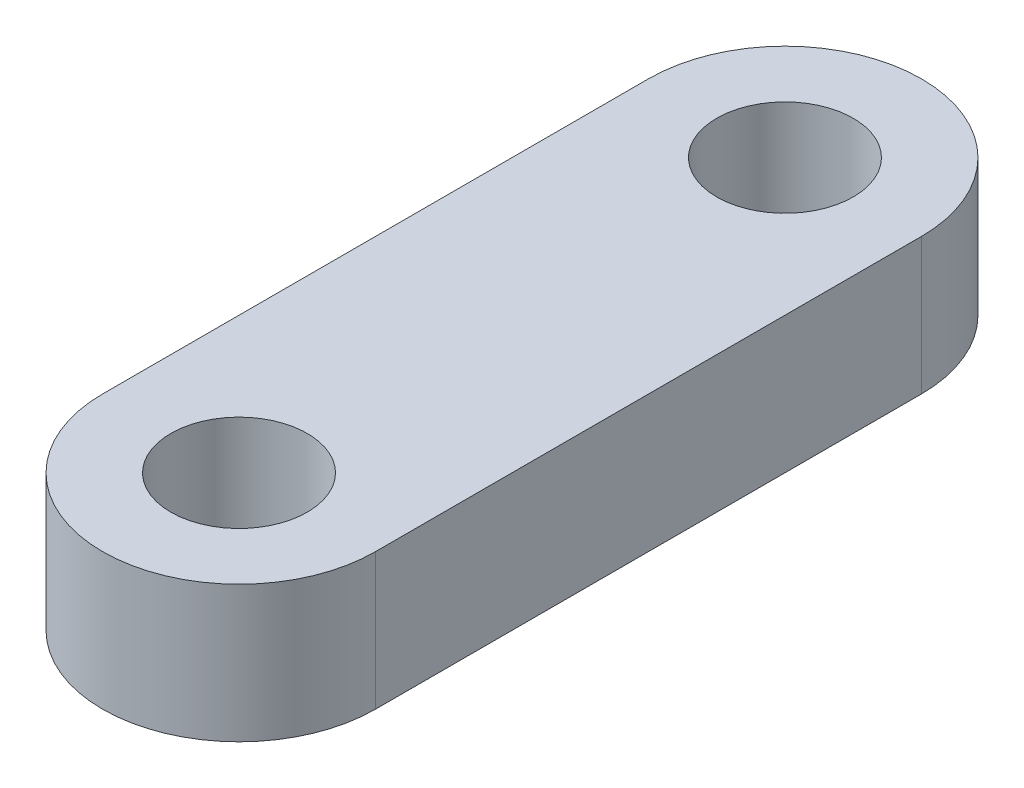
ISO-10303-21;
HEADER;
FILE_DESCRIPTION(('STEP AP214'),'2;1');
FILE_NAME('part.step','',(''),(''),'','','');
FILE_SCHEMA(('AUTOMOTIVE_DESIGN { 1 0 10303 214 1 1 1 1 }'));
ENDSEC;
DATA;
#1=APPLICATION_CONTEXT('core data for automotive mechanical design processes');
#2=APPLICATION_PROTOCOL_DEFINITION('international standard','automotive_design',2000,#1);
#3=PRODUCT_CONTEXT('',#1,'mechanical');
#4=PRODUCT('Part','Part','',(#3));
#5=PRODUCT_RELATED_PRODUCT_CATEGORY('part','',(#4));
#6=PRODUCT_DEFINITION_FORMATION('','',#4);
#7=PRODUCT_DEFINITION_CONTEXT('part definition',#1,'design');
#8=PRODUCT_DEFINITION('design','',#6,#7);
#9=PRODUCT_DEFINITION_SHAPE('','',#8);
#10=(LENGTH_UNIT() NAMED_UNIT(*) SI_UNIT(.MILLI.,.METRE.));
#11=(NAMED_UNIT(*) PLANE_ANGLE_UNIT() SI_UNIT($,.RADIAN.));
#12=(NAMED_UNIT(*) SI_UNIT($,.STERADIAN.) SOLID_ANGLE_UNIT());
#13=UNCERTAINTY_MEASURE_WITH_UNIT(LENGTH_MEASURE(1.E-05),#10,'distance_accuracy_value','');
#14=(GEOMETRIC_REPRESENTATION_CONTEXT(3) GLOBAL_UNCERTAINTY_ASSIGNED_CONTEXT((#13)) GLOBAL_UNIT_ASSIGNED_CONTEXT((#10,
#11,#12)) REPRESENTATION_CONTEXT('',''));
#15=CARTESIAN_POINT('',(0.,0.,0.));
#16=DIRECTION('',(0.,0.,1.));
#17=DIRECTION('',(1.,0.,0.));
#18=AXIS2_PLACEMENT_3D('',#15,#16,#17);
#19=CARTESIAN_POINT('',(0.,5.,-10.));
#20=DIRECTION('',(0.,-1.,0.));
#21=DIRECTION('',(0.,0.,-1.));
#22=AXIS2_PLACEMENT_3D('',#19,#20,#21);
#23=CYLINDRICAL_SURFACE('',#22,5.);
#24=CARTESIAN_POINT('',(0.,0.,-10.));
#25=DIRECTION('',(0.,1.,0.));
#26=DIRECTION('',(0.,0.,-1.));
#27=AXIS2_PLACEMENT_3D('',#24,#25,#26);
#28=CIRCLE('',#27,5.);
#29=CARTESIAN_POINT('',(5.,0.,-10.));
#30=VERTEX_POINT('',#29);
#31=CARTESIAN_POINT('',(-5.,0.,-10.));
#32=VERTEX_POINT('',#31);
#33=EDGE_CURVE('E96',#30,#32,#28,.T.);
#34=ORIENTED_EDGE('',*,*,#33,.T.);
#35=DIRECTION('',(0.,-1.,0.));
#36=VECTOR('',#35,1.);
#37=CARTESIAN_POINT('',(-5.,5.,-10.));
#38=LINE('',#37,#36);
#39=CARTESIAN_POINT('',(-5.,5.,-10.));
#40=VERTEX_POINT('',#39);
#41=EDGE_CURVE('E11',#40,#32,#38,.T.);
#42=ORIENTED_EDGE('',*,*,#41,.F.);
#43=CARTESIAN_POINT('',(0.,5.,-10.));
#44=DIRECTION('',(0.,1.,0.));
#45=DIRECTION('',(0.,0.,-1.));
#46=AXIS2_PLACEMENT_3D('',#43,#44,#45);
#47=CIRCLE('',#46,5.);
#48=CARTESIAN_POINT('',(5.,5.,-10.));
#49=VERTEX_POINT('',#48);
#50=EDGE_CURVE('E84',#49,#40,#47,.T.);
#51=ORIENTED_EDGE('',*,*,#50,.F.);
#52=DIRECTION('',(0.,-1.,0.));
#53=VECTOR('',#52,1.);
#54=CARTESIAN_POINT('',(5.,5.,-10.));
#55=LINE('',#54,#53);
#56=EDGE_CURVE('E92',#49,#30,#55,.T.);
#57=ORIENTED_EDGE('',*,*,#56,.T.);
#58=EDGE_LOOP('',(#34,#42,#51,#57));
#59=FACE_BOUND('',#58,.T.);
#60=ADVANCED_FACE('F33',(#59),#23,.T.);
#61=CARTESIAN_POINT('',(-5.,5.,10.));
#62=DIRECTION('',(1.,0.,0.));
#63=DIRECTION('',(0.,0.,-1.));
#64=AXIS2_PLACEMENT_3D('',#61,#62,#63);
#65=PLANE('',#64);
#66=DIRECTION('',(0.,0.,1.));
#67=VECTOR('',#66,1.);
#68=CARTESIAN_POINT('',(-5.,0.,10.));
#69=LINE('',#68,#67);
#70=CARTESIAN_POINT('',(-5.,0.,10.));
#71=VERTEX_POINT('',#70);
#72=EDGE_CURVE('E88',#32,#71,#69,.T.);
#73=ORIENTED_EDGE('',*,*,#72,.T.);
#74=DIRECTION('',(0.,-1.,0.));
#75=VECTOR('',#74,1.);
#76=CARTESIAN_POINT('',(-5.,5.,10.));
#77=LINE('',#76,#75);
#78=CARTESIAN_POINT('',(-5.,5.,10.));
#79=VERTEX_POINT('',#78);
#80=EDGE_CURVE('E41',#79,#71,#77,.T.);
#81=ORIENTED_EDGE('',*,*,#80,.F.);
#82=DIRECTION('',(0.,0.,1.));
#83=VECTOR('',#82,1.);
#84=CARTESIAN_POINT('',(-5.,5.,10.));
#85=LINE('',#84,#83);
#86=EDGE_CURVE('E79',#40,#79,#85,.T.);
#87=ORIENTED_EDGE('',*,*,#86,.F.);
#88=ORIENTED_EDGE('',*,*,#41,.T.);
#89=EDGE_LOOP('',(#73,#81,#87,#88));
#90=FACE_BOUND('',#89,.T.);
#91=ADVANCED_FACE('F87',(#90),#65,.F.);
#92=CARTESIAN_POINT('',(0.,5.,10.));
#93=DIRECTION('',(0.,-1.,0.));
#94=DIRECTION('',(0.,0.,-1.));
#95=AXIS2_PLACEMENT_3D('',#92,#93,#94);
#96=CYLINDRICAL_SURFACE('',#95,5.);
#97=CARTESIAN_POINT('',(0.,0.,10.));
#98=DIRECTION('',(0.,1.,0.));
#99=DIRECTION('',(0.,0.,1.));
#100=AXIS2_PLACEMENT_3D('',#97,#98,#99);
#101=CIRCLE('',#100,5.);
#102=CARTESIAN_POINT('',(5.,0.,10.));
#103=VERTEX_POINT('',#102);
#104=EDGE_CURVE('E66',#71,#103,#101,.T.);
#105=ORIENTED_EDGE('',*,*,#104,.T.);
#106=DIRECTION('',(0.,-1.,0.));
#107=VECTOR('',#106,1.);
#108=CARTESIAN_POINT('',(5.,5.,10.));
#109=LINE('',#108,#107);
#110=CARTESIAN_POINT('',(5.,5.,10.));
#111=VERTEX_POINT('',#110);
#112=EDGE_CURVE('E89',#111,#103,#109,.T.);
#113=ORIENTED_EDGE('',*,*,#112,.F.);
#114=CARTESIAN_POINT('',(0.,5.,10.));
#115=DIRECTION('',(0.,1.,0.));
#116=DIRECTION('',(0.,0.,1.));
#117=AXIS2_PLACEMENT_3D('',#114,#115,#116);
#118=CIRCLE('',#117,5.);
#119=EDGE_CURVE('E82',#79,#111,#118,.T.);
#120=ORIENTED_EDGE('',*,*,#119,.F.);
#121=ORIENTED_EDGE('',*,*,#80,.T.);
#122=EDGE_LOOP('',(#105,#113,#120,#121));
#123=FACE_BOUND('',#122,.T.);
#124=ADVANCED_FACE('F90',(#123),#96,.T.);
#125=CARTESIAN_POINT('',(5.,5.,10.));
#126=DIRECTION('',(-1.,0.,0.));
#127=DIRECTION('',(0.,0.,1.));
#128=AXIS2_PLACEMENT_3D('',#125,#126,#127);
#129=PLANE('',#128);
#130=DIRECTION('',(0.,0.,-1.));
#131=VECTOR('',#130,1.);
#132=CARTESIAN_POINT('',(5.,0.,10.));
#133=LINE('',#132,#131);
#134=EDGE_CURVE('E72',#103,#30,#133,.T.);
#135=ORIENTED_EDGE('',*,*,#134,.T.);
#136=ORIENTED_EDGE('',*,*,#56,.F.);
#137=DIRECTION('',(0.,0.,-1.));
#138=VECTOR('',#137,1.);
#139=CARTESIAN_POINT('',(5.,5.,10.));
#140=LINE('',#139,#138);
#141=EDGE_CURVE('E49',#111,#49,#140,.T.);
#142=ORIENTED_EDGE('',*,*,#141,.F.);
#143=ORIENTED_EDGE('',*,*,#112,.T.);
#144=EDGE_LOOP('',(#135,#136,#142,#143));
#145=FACE_BOUND('',#144,.T.);
#146=ADVANCED_FACE('F104',(#145),#129,.F.);
#147=CARTESIAN_POINT('',(0.,5.,-10.));
#148=DIRECTION('',(0.,-1.,0.));
#149=DIRECTION('',(0.,0.,-1.));
#150=AXIS2_PLACEMENT_3D('',#147,#148,#149);
#151=PLANE('',#150);
#152=CARTESIAN_POINT('',(0.,5.,-10.));
#153=DIRECTION('',(0.,1.,0.));
#154=DIRECTION('',(0.,0.,1.));
#155=AXIS2_PLACEMENT_3D('',#152,#153,#154);
#156=CIRCLE('',#155,2.5);
#157=CARTESIAN_POINT('',(0.,5.,-7.5));
#158=VERTEX_POINT('',#157);
#159=EDGE_CURVE('E116',#158,#158,#156,.T.);
#160=ORIENTED_EDGE('',*,*,#159,.F.);
#161=EDGE_LOOP('',(#160));
#162=FACE_BOUND('',#161,.T.);
#163=CARTESIAN_POINT('',(0.,5.,10.));
#164=DIRECTION('',(0.,1.,0.));
#165=DIRECTION('',(0.,0.,1.));
#166=AXIS2_PLACEMENT_3D('',#163,#164,#165);
#167=CIRCLE('',#166,2.5);
#168=CARTESIAN_POINT('',(0.,5.,12.5));
#169=VERTEX_POINT('',#168);
#170=EDGE_CURVE('E110',#169,#169,#167,.T.);
#171=ORIENTED_EDGE('',*,*,#170,.F.);
#172=EDGE_LOOP('',(#171));
#173=FACE_BOUND('',#172,.T.);
#174=ORIENTED_EDGE('',*,*,#50,.T.);
#175=ORIENTED_EDGE('',*,*,#86,.T.);
#176=ORIENTED_EDGE('',*,*,#119,.T.);
#177=ORIENTED_EDGE('',*,*,#141,.T.);
#178=EDGE_LOOP('',(#174,#175,#176,#177));
#179=FACE_BOUND('',#178,.T.);
#180=ADVANCED_FACE('F80',(#162,#173,#179),#151,.F.);
#181=CARTESIAN_POINT('',(0.,0.,-10.));
#182=DIRECTION('',(0.,-1.,0.));
#183=DIRECTION('',(0.,0.,-1.));
#184=AXIS2_PLACEMENT_3D('',#181,#182,#183);
#185=PLANE('',#184);
#186=CARTESIAN_POINT('',(0.,0.,-10.));
#187=DIRECTION('',(0.,1.,0.));
#188=DIRECTION('',(0.,0.,1.));
#189=AXIS2_PLACEMENT_3D('',#186,#187,#188);
#190=CIRCLE('',#189,2.5);
#191=CARTESIAN_POINT('',(0.,0.,-7.5));
#192=VERTEX_POINT('',#191);
#193=EDGE_CURVE('E99',#192,#192,#190,.T.);
#194=ORIENTED_EDGE('',*,*,#193,.T.);
#195=EDGE_LOOP('',(#194));
#196=FACE_BOUND('',#195,.T.);
#197=CARTESIAN_POINT('',(0.,0.,10.));
#198=DIRECTION('',(0.,1.,0.));
#199=DIRECTION('',(0.,0.,1.));
#200=AXIS2_PLACEMENT_3D('',#197,#198,#199);
#201=CIRCLE('',#200,2.5);
#202=CARTESIAN_POINT('',(0.,0.,12.5));
#203=VERTEX_POINT('',#202);
#204=EDGE_CURVE('E113',#203,#203,#201,.T.);
#205=ORIENTED_EDGE('',*,*,#204,.T.);
#206=EDGE_LOOP('',(#205));
#207=FACE_BOUND('',#206,.T.);
#208=ORIENTED_EDGE('',*,*,#33,.F.);
#209=ORIENTED_EDGE('',*,*,#134,.F.);
#210=ORIENTED_EDGE('',*,*,#104,.F.);
#211=ORIENTED_EDGE('',*,*,#72,.F.);
#212=EDGE_LOOP('',(#208,#209,#210,#211));
#213=FACE_BOUND('',#212,.T.);
#214=ADVANCED_FACE('F107',(#196,#207,#213),#185,.T.);
#215=CARTESIAN_POINT('',(0.,0.,10.));
#216=DIRECTION('',(0.,1.,0.));
#217=DIRECTION('',(0.,0.,1.));
#218=AXIS2_PLACEMENT_3D('',#215,#216,#217);
#219=CYLINDRICAL_SURFACE('',#218,2.5);
#220=ORIENTED_EDGE('',*,*,#204,.F.);
#221=EDGE_LOOP('',(#220));
#222=FACE_BOUND('',#221,.T.);
#223=ORIENTED_EDGE('',*,*,#170,.T.);
#224=EDGE_LOOP('',(#223));
#225=FACE_BOUND('',#224,.T.);
#226=ADVANCED_FACE('F127',(#222,#225),#219,.F.);
#227=CARTESIAN_POINT('',(0.,0.,-10.));
#228=DIRECTION('',(0.,1.,0.));
#229=DIRECTION('',(0.,0.,1.));
#230=AXIS2_PLACEMENT_3D('',#227,#228,#229);
#231=CYLINDRICAL_SURFACE('',#230,2.5);
#232=ORIENTED_EDGE('',*,*,#193,.F.);
#233=EDGE_LOOP('',(#232));
#234=FACE_BOUND('',#233,.T.);
#235=ORIENTED_EDGE('',*,*,#159,.T.);
#236=EDGE_LOOP('',(#235));
#237=FACE_BOUND('',#236,.T.);
#238=ADVANCED_FACE('F124',(#234,#237),#231,.F.);
#239=CLOSED_SHELL('',(#60,#91,#124,#146,#180,#214,#226,#238));
#240=MANIFOLD_SOLID_BREP('B2',#239);
#241=ADVANCED_BREP_SHAPE_REPRESENTATION('',(#18,#240),#14);
#242=SHAPE_DEFINITION_REPRESENTATION(#9,#241);
ENDSEC;
END-ISO-10303-21;
